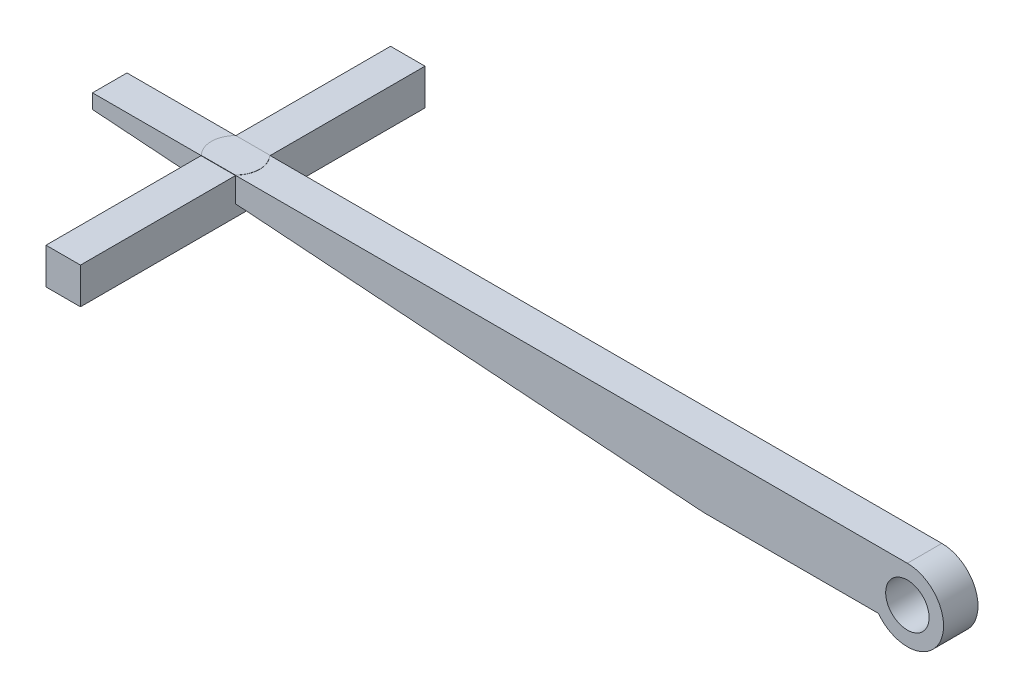
ISO-10303-21;
HEADER;
FILE_DESCRIPTION(('STEP AP214'),'2;1');
FILE_NAME('part.step','',(''),(''),'','','');
FILE_SCHEMA(('AUTOMOTIVE_DESIGN { 1 0 10303 214 1 1 1 1 }'));
ENDSEC;
DATA;
#1=APPLICATION_CONTEXT('core data for automotive mechanical design processes');
#2=APPLICATION_PROTOCOL_DEFINITION('international standard','automotive_design',2000,#1);
#3=PRODUCT_CONTEXT('',#1,'mechanical');
#4=PRODUCT('Part','Part','',(#3));
#5=PRODUCT_RELATED_PRODUCT_CATEGORY('part','',(#4));
#6=PRODUCT_DEFINITION_FORMATION('','',#4);
#7=PRODUCT_DEFINITION_CONTEXT('part definition',#1,'design');
#8=PRODUCT_DEFINITION('design','',#6,#7);
#9=PRODUCT_DEFINITION_SHAPE('','',#8);
#10=(LENGTH_UNIT() NAMED_UNIT(*) SI_UNIT(.MILLI.,.METRE.));
#11=(NAMED_UNIT(*) PLANE_ANGLE_UNIT() SI_UNIT($,.RADIAN.));
#12=(NAMED_UNIT(*) SI_UNIT($,.STERADIAN.) SOLID_ANGLE_UNIT());
#13=UNCERTAINTY_MEASURE_WITH_UNIT(LENGTH_MEASURE(1.E-05),#10,'distance_accuracy_value','');
#14=(GEOMETRIC_REPRESENTATION_CONTEXT(3) GLOBAL_UNCERTAINTY_ASSIGNED_CONTEXT((#13)) GLOBAL_UNIT_ASSIGNED_CONTEXT((#10,
#11,#12)) REPRESENTATION_CONTEXT('',''));
#15=CARTESIAN_POINT('',(0.,0.,0.));
#16=DIRECTION('',(0.,0.,1.));
#17=DIRECTION('',(1.,0.,0.));
#18=AXIS2_PLACEMENT_3D('',#15,#16,#17);
#19=CARTESIAN_POINT('',(-0.0500000000000828,10.5499999999999,5.));
#20=DIRECTION('',(0.,-1.,0.));
#21=DIRECTION('',(1.,0.,0.));
#22=AXIS2_PLACEMENT_3D('',#19,#20,#21);
#23=PLANE('',#22);
#24=CARTESIAN_POINT('',(-200.05,10.5500000000006,0.));
#25=DIRECTION('',(0.,1.,0.));
#26=DIRECTION('',(-1.,0.,0.));
#27=AXIS2_PLACEMENT_3D('',#24,#25,#26);
#28=CIRCLE('',#27,7.00000000000001);
#29=CARTESIAN_POINT('',(-195.151020514434,10.5500000000006,5.));
#30=VERTEX_POINT('',#29);
#31=CARTESIAN_POINT('',(-195.151020514434,10.5500000000006,-5.));
#32=VERTEX_POINT('',#31);
#33=EDGE_CURVE('E59',#30,#32,#28,.T.);
#34=ORIENTED_EDGE('',*,*,#33,.F.);
#35=DIRECTION('',(-1.,0.,0.));
#36=VECTOR('',#35,1.);
#37=CARTESIAN_POINT('',(-0.0500000000000828,10.5499999999999,5.));
#38=LINE('',#37,#36);
#39=CARTESIAN_POINT('',(-0.0500000000000827,10.5499999999999,5.));
#40=VERTEX_POINT('',#39);
#41=EDGE_CURVE('E200',#40,#30,#38,.T.);
#42=ORIENTED_EDGE('',*,*,#41,.F.);
#43=DIRECTION('',(0.,0.,-1.));
#44=VECTOR('',#43,1.);
#45=CARTESIAN_POINT('',(-0.0500000000000827,10.5499999999999,5.));
#46=LINE('',#45,#44);
#47=CARTESIAN_POINT('',(-0.0500000000000827,10.5499999999999,-5.));
#48=VERTEX_POINT('',#47);
#49=EDGE_CURVE('E349',#40,#48,#46,.T.);
#50=ORIENTED_EDGE('',*,*,#49,.T.);
#51=DIRECTION('',(-1.,0.,0.));
#52=VECTOR('',#51,1.);
#53=CARTESIAN_POINT('',(-0.0500000000000828,10.5499999999999,-5.));
#54=LINE('',#53,#52);
#55=EDGE_CURVE('E310',#48,#32,#54,.T.);
#56=ORIENTED_EDGE('',*,*,#55,.T.);
#57=EDGE_LOOP('',(#34,#42,#50,#56));
#58=FACE_BOUND('',#57,.T.);
#59=ADVANCED_FACE('F43',(#58),#23,.F.);
#60=CARTESIAN_POINT('',(-0.79213250000149,-10.3972819196618,5.));
#61=DIRECTION('',(-0.0708573888598422,-0.997486456270944,0.));
#62=DIRECTION('',(0.997486456270944,-0.0708573888598422,0.));
#63=AXIS2_PLACEMENT_3D('',#60,#61,#62);
#64=PLANE('',#63);
#65=DIRECTION('',(-0.997486456270944,0.0708573888598422,0.));
#66=VECTOR('',#65,1.);
#67=CARTESIAN_POINT('',(-0.79213250000149,-10.3972819196618,-5.));
#68=LINE('',#67,#66);
#69=CARTESIAN_POINT('',(-205.05,4.11236786469404,-5.));
#70=VERTEX_POINT('',#69);
#71=CARTESIAN_POINT('',(-236.55,6.3500000000007,-5.));
#72=VERTEX_POINT('',#71);
#73=EDGE_CURVE('E317',#70,#72,#68,.T.);
#74=ORIENTED_EDGE('',*,*,#73,.F.);
#75=DIRECTION('',(0.,0.,1.));
#76=VECTOR('',#75,1.);
#77=CARTESIAN_POINT('',(-205.05,4.11236786469404,5.));
#78=LINE('',#77,#76);
#79=CARTESIAN_POINT('',(-205.05,4.11236786469404,5.));
#80=VERTEX_POINT('',#79);
#81=EDGE_CURVE('E263',#70,#80,#78,.T.);
#82=ORIENTED_EDGE('',*,*,#81,.T.);
#83=DIRECTION('',(-0.997486456270944,0.0708573888598422,0.));
#84=VECTOR('',#83,1.);
#85=CARTESIAN_POINT('',(-0.79213250000149,-10.3972819196618,5.));
#86=LINE('',#85,#84);
#87=CARTESIAN_POINT('',(-236.55,6.3500000000007,5.));
#88=VERTEX_POINT('',#87);
#89=EDGE_CURVE('E287',#80,#88,#86,.T.);
#90=ORIENTED_EDGE('',*,*,#89,.T.);
#91=DIRECTION('',(0.,0.,-1.));
#92=VECTOR('',#91,1.);
#93=CARTESIAN_POINT('',(-236.55,6.3500000000007,5.));
#94=LINE('',#93,#92);
#95=EDGE_CURVE('E341',#88,#72,#94,.T.);
#96=ORIENTED_EDGE('',*,*,#95,.T.);
#97=EDGE_LOOP('',(#74,#82,#90,#96));
#98=FACE_BOUND('',#97,.T.);
#99=ADVANCED_FACE('F404',(#98),#64,.T.);
#100=CARTESIAN_POINT('',(-0.0500000000001194,0.0499999999998835,5.));
#101=DIRECTION('',(0.,0.,1.));
#102=DIRECTION('',(0.,-1.,0.));
#103=AXIS2_PLACEMENT_3D('',#100,#101,#102);
#104=PLANE('',#103);
#105=CARTESIAN_POINT('',(-0.0500000000001194,0.0499999999998835,5.));
#106=DIRECTION('',(0.,0.,1.));
#107=DIRECTION('',(0.,-1.,0.));
#108=AXIS2_PLACEMENT_3D('',#105,#106,#107);
#109=CIRCLE('',#108,6.3);
#110=CARTESIAN_POINT('',(-0.0500000000001414,-6.25000000000012,5.));
#111=VERTEX_POINT('',#110);
#112=EDGE_CURVE('E298',#111,#111,#109,.T.);
#113=ORIENTED_EDGE('',*,*,#112,.F.);
#114=EDGE_LOOP('',(#113));
#115=FACE_BOUND('',#114,.T.);
#116=ORIENTED_EDGE('',*,*,#89,.F.);
#117=DIRECTION('',(0.,1.,0.));
#118=VECTOR('',#117,1.);
#119=CARTESIAN_POINT('',(-205.05,0.0499999999998835,5.));
#120=LINE('',#119,#118);
#121=CARTESIAN_POINT('',(-205.05,10.5,5.));
#122=VERTEX_POINT('',#121);
#123=EDGE_CURVE('E267',#80,#122,#120,.T.);
#124=ORIENTED_EDGE('',*,*,#123,.T.);
#125=DIRECTION('',(-1.,0.,0.));
#126=VECTOR('',#125,1.);
#127=CARTESIAN_POINT('',(-0.0500000000001194,10.5,5.));
#128=LINE('',#127,#126);
#129=CARTESIAN_POINT('',(-195.05,10.5,5.));
#130=VERTEX_POINT('',#129);
#131=EDGE_CURVE('E254',#130,#122,#128,.T.);
#132=ORIENTED_EDGE('',*,*,#131,.F.);
#133=DIRECTION('',(0.,1.,0.));
#134=VECTOR('',#133,1.);
#135=CARTESIAN_POINT('',(-195.05,0.0499999999998835,5.));
#136=LINE('',#135,#134);
#137=CARTESIAN_POINT('',(-195.05,3.40200845666018,5.));
#138=VERTEX_POINT('',#137);
#139=EDGE_CURVE('E260',#138,#130,#136,.T.);
#140=ORIENTED_EDGE('',*,*,#139,.F.);
#141=CARTESIAN_POINT('',(-59.1750000000001,-6.24999999999991,5.));
#142=VERTEX_POINT('',#141);
#143=EDGE_CURVE('E288',#142,#138,#86,.T.);
#144=ORIENTED_EDGE('',*,*,#143,.F.);
#145=DIRECTION('',(1.,0.,0.));
#146=VECTOR('',#145,1.);
#147=CARTESIAN_POINT('',(-0.0500000000001413,-6.25000000000012,5.));
#148=LINE('',#147,#146);
#149=CARTESIAN_POINT('',(-8.45000000000014,-6.25000000000009,5.));
#150=VERTEX_POINT('',#149);
#151=EDGE_CURVE('E292',#142,#150,#148,.T.);
#152=ORIENTED_EDGE('',*,*,#151,.T.);
#153=CARTESIAN_POINT('',(-0.0500000000001194,0.0499999999998835,5.));
#154=DIRECTION('',(0.,0.,1.));
#155=DIRECTION('',(0.,-1.,0.));
#156=AXIS2_PLACEMENT_3D('',#153,#154,#155);
#157=CIRCLE('',#156,10.5);
#158=CARTESIAN_POINT('',(-1.53426500000282,-10.3445638393234,5.));
#159=VERTEX_POINT('',#158);
#160=EDGE_CURVE('E295',#150,#159,#157,.T.);
#161=ORIENTED_EDGE('',*,*,#160,.T.);
#162=DIRECTION('',(-0.997486456270944,0.0708573888598422,0.));
#163=VECTOR('',#162,1.);
#164=CARTESIAN_POINT('',(-0.79213250000149,-10.3972819196618,5.));
#165=LINE('',#164,#163);
#166=CARTESIAN_POINT('',(-0.0500000000001561,-10.4500000000001,5.));
#167=VERTEX_POINT('',#166);
#168=EDGE_CURVE('E272',#167,#159,#165,.T.);
#169=ORIENTED_EDGE('',*,*,#168,.F.);
#170=CARTESIAN_POINT('',(-0.0500000000001194,0.0499999999998835,5.));
#171=DIRECTION('',(0.,0.,1.));
#172=DIRECTION('',(0.,-1.,0.));
#173=AXIS2_PLACEMENT_3D('',#170,#171,#172);
#174=CIRCLE('',#173,10.5);
#175=EDGE_CURVE('E276',#167,#40,#174,.T.);
#176=ORIENTED_EDGE('',*,*,#175,.T.);
#177=ORIENTED_EDGE('',*,*,#41,.T.);
#178=DIRECTION('',(0.,-1.,0.));
#179=VECTOR('',#178,1.);
#180=CARTESIAN_POINT('',(-195.151020514434,10.6000000000006,5.));
#181=LINE('',#180,#179);
#182=CARTESIAN_POINT('',(-195.151020514434,10.6000000000006,5.));
#183=VERTEX_POINT('',#182);
#184=EDGE_CURVE('E180',#183,#30,#181,.T.);
#185=ORIENTED_EDGE('',*,*,#184,.F.);
#186=DIRECTION('',(1.,0.,0.));
#187=VECTOR('',#186,1.);
#188=CARTESIAN_POINT('',(0.,10.5999999999999,5.));
#189=LINE('',#188,#187);
#190=CARTESIAN_POINT('',(-204.948979485566,10.6000000000006,5.));
#191=VERTEX_POINT('',#190);
#192=EDGE_CURVE('E187',#191,#183,#189,.T.);
#193=ORIENTED_EDGE('',*,*,#192,.F.);
#194=DIRECTION('',(0.,-1.,0.));
#195=VECTOR('',#194,1.);
#196=CARTESIAN_POINT('',(-204.948979485566,10.6000000000006,5.));
#197=LINE('',#196,#195);
#198=CARTESIAN_POINT('',(-204.948979485566,10.5500000000006,5.));
#199=VERTEX_POINT('',#198);
#200=EDGE_CURVE('E415',#191,#199,#197,.T.);
#201=ORIENTED_EDGE('',*,*,#200,.T.);
#202=CARTESIAN_POINT('',(-236.55,10.5500000000007,5.));
#203=VERTEX_POINT('',#202);
#204=EDGE_CURVE('E280',#199,#203,#38,.T.);
#205=ORIENTED_EDGE('',*,*,#204,.T.);
#206=DIRECTION('',(0.,-1.,0.));
#207=VECTOR('',#206,1.);
#208=CARTESIAN_POINT('',(-236.55,0.0500000000007161,5.));
#209=LINE('',#208,#207);
#210=EDGE_CURVE('E283',#203,#88,#209,.T.);
#211=ORIENTED_EDGE('',*,*,#210,.T.);
#212=EDGE_LOOP('',(#116,#124,#132,#140,#144,#152,#161,#169,#176,#177,#185,#193,#201,#205,#211));
#213=FACE_BOUND('',#212,.T.);
#214=ADVANCED_FACE('F199',(#115,#213),#104,.T.);
#215=CARTESIAN_POINT('',(-0.0500000000001194,0.0499999999998835,-5.));
#216=DIRECTION('',(0.,0.,1.));
#217=DIRECTION('',(0.,-1.,0.));
#218=AXIS2_PLACEMENT_3D('',#215,#216,#217);
#219=PLANE('',#218);
#220=CARTESIAN_POINT('',(-0.0500000000001194,0.0499999999998835,-5.));
#221=DIRECTION('',(0.,0.,1.));
#222=DIRECTION('',(0.,-1.,0.));
#223=AXIS2_PLACEMENT_3D('',#220,#221,#222);
#224=CIRCLE('',#223,6.3);
#225=CARTESIAN_POINT('',(-0.0500000000001414,-6.25000000000012,-5.));
#226=VERTEX_POINT('',#225);
#227=EDGE_CURVE('E277',#226,#226,#224,.T.);
#228=ORIENTED_EDGE('',*,*,#227,.T.);
#229=EDGE_LOOP('',(#228));
#230=FACE_BOUND('',#229,.T.);
#231=DIRECTION('',(0.,1.,0.));
#232=VECTOR('',#231,1.);
#233=CARTESIAN_POINT('',(-205.05,0.0499999999998835,-5.));
#234=LINE('',#233,#232);
#235=CARTESIAN_POINT('',(-205.05,10.5,-5.));
#236=VERTEX_POINT('',#235);
#237=EDGE_CURVE('E11',#70,#236,#234,.T.);
#238=ORIENTED_EDGE('',*,*,#237,.F.);
#239=ORIENTED_EDGE('',*,*,#73,.T.);
#240=DIRECTION('',(0.,-1.,0.));
#241=VECTOR('',#240,1.);
#242=CARTESIAN_POINT('',(-236.55,0.0500000000007161,-5.));
#243=LINE('',#242,#241);
#244=CARTESIAN_POINT('',(-236.55,10.5500000000007,-5.));
#245=VERTEX_POINT('',#244);
#246=EDGE_CURVE('E313',#245,#72,#243,.T.);
#247=ORIENTED_EDGE('',*,*,#246,.F.);
#248=CARTESIAN_POINT('',(-204.948979485566,10.5500000000006,-5.));
#249=VERTEX_POINT('',#248);
#250=EDGE_CURVE('E309',#249,#245,#54,.T.);
#251=ORIENTED_EDGE('',*,*,#250,.F.);
#252=DIRECTION('',(0.,-1.,0.));
#253=VECTOR('',#252,1.);
#254=CARTESIAN_POINT('',(-204.948979485566,10.6000000000006,-5.));
#255=LINE('',#254,#253);
#256=CARTESIAN_POINT('',(-204.948979485566,10.6000000000006,-5.));
#257=VERTEX_POINT('',#256);
#258=EDGE_CURVE('E209',#257,#249,#255,.T.);
#259=ORIENTED_EDGE('',*,*,#258,.F.);
#260=DIRECTION('',(-1.,0.,0.));
#261=VECTOR('',#260,1.);
#262=CARTESIAN_POINT('',(0.,10.5999999999999,-5.));
#263=LINE('',#262,#261);
#264=CARTESIAN_POINT('',(-195.151020514434,10.6000000000006,-5.));
#265=VERTEX_POINT('',#264);
#266=EDGE_CURVE('E186',#265,#257,#263,.T.);
#267=ORIENTED_EDGE('',*,*,#266,.F.);
#268=DIRECTION('',(0.,-1.,0.));
#269=VECTOR('',#268,1.);
#270=CARTESIAN_POINT('',(-195.151020514434,10.6000000000006,-5.));
#271=LINE('',#270,#269);
#272=EDGE_CURVE('E182',#265,#32,#271,.T.);
#273=ORIENTED_EDGE('',*,*,#272,.T.);
#274=ORIENTED_EDGE('',*,*,#55,.F.);
#275=CARTESIAN_POINT('',(-0.0500000000001194,0.0499999999998835,-5.));
#276=DIRECTION('',(0.,0.,1.));
#277=DIRECTION('',(0.,-1.,0.));
#278=AXIS2_PLACEMENT_3D('',#275,#276,#277);
#279=CIRCLE('',#278,10.5);
#280=CARTESIAN_POINT('',(-0.0500000000001561,-10.4500000000001,-5.));
#281=VERTEX_POINT('',#280);
#282=EDGE_CURVE('E306',#281,#48,#279,.T.);
#283=ORIENTED_EDGE('',*,*,#282,.F.);
#284=DIRECTION('',(-0.997486456270944,0.0708573888598422,0.));
#285=VECTOR('',#284,1.);
#286=CARTESIAN_POINT('',(-0.79213250000149,-10.3972819196618,-5.));
#287=LINE('',#286,#285);
#288=CARTESIAN_POINT('',(-1.53426500000282,-10.3445638393234,-5.));
#289=VERTEX_POINT('',#288);
#290=EDGE_CURVE('E271',#281,#289,#287,.T.);
#291=ORIENTED_EDGE('',*,*,#290,.T.);
#292=CARTESIAN_POINT('',(-0.0500000000001194,0.0499999999998835,-5.));
#293=DIRECTION('',(0.,0.,1.));
#294=DIRECTION('',(0.,-1.,0.));
#295=AXIS2_PLACEMENT_3D('',#292,#293,#294);
#296=CIRCLE('',#295,10.5);
#297=CARTESIAN_POINT('',(-8.45000000000014,-6.25000000000009,-5.));
#298=VERTEX_POINT('',#297);
#299=EDGE_CURVE('E325',#298,#289,#296,.T.);
#300=ORIENTED_EDGE('',*,*,#299,.F.);
#301=DIRECTION('',(1.,0.,0.));
#302=VECTOR('',#301,1.);
#303=CARTESIAN_POINT('',(-0.0500000000001413,-6.25000000000012,-5.));
#304=LINE('',#303,#302);
#305=CARTESIAN_POINT('',(-59.1750000000001,-6.24999999999991,-5.));
#306=VERTEX_POINT('',#305);
#307=EDGE_CURVE('E322',#306,#298,#304,.T.);
#308=ORIENTED_EDGE('',*,*,#307,.F.);
#309=CARTESIAN_POINT('',(-195.05,3.40200845666018,-5.));
#310=VERTEX_POINT('',#309);
#311=EDGE_CURVE('E318',#306,#310,#68,.T.);
#312=ORIENTED_EDGE('',*,*,#311,.T.);
#313=DIRECTION('',(0.,1.,0.));
#314=VECTOR('',#313,1.);
#315=CARTESIAN_POINT('',(-195.05,0.0499999999998835,-5.));
#316=LINE('',#315,#314);
#317=CARTESIAN_POINT('',(-195.05,10.5,-5.));
#318=VERTEX_POINT('',#317);
#319=EDGE_CURVE('E52',#310,#318,#316,.T.);
#320=ORIENTED_EDGE('',*,*,#319,.T.);
#321=DIRECTION('',(-1.,0.,0.));
#322=VECTOR('',#321,1.);
#323=CARTESIAN_POINT('',(-0.0500000000001194,10.5,-5.));
#324=LINE('',#323,#322);
#325=EDGE_CURVE('E356',#318,#236,#324,.T.);
#326=ORIENTED_EDGE('',*,*,#325,.T.);
#327=EDGE_LOOP('',(#238,#239,#247,#251,#259,#267,#273,#274,#283,#291,#300,#308,#312,#320,#326));
#328=FACE_BOUND('',#327,.T.);
#329=ADVANCED_FACE('F363',(#230,#328),#219,.F.);
#330=CARTESIAN_POINT('',(-0.79213250000149,-10.3972819196618,5.));
#331=DIRECTION('',(-0.0708573888598422,-0.997486456270944,0.));
#332=DIRECTION('',(0.997486456270944,-0.0708573888598422,0.));
#333=AXIS2_PLACEMENT_3D('',#330,#331,#332);
#334=PLANE('',#333);
#335=ORIENTED_EDGE('',*,*,#290,.F.);
#336=DIRECTION('',(0.,0.,-1.));
#337=VECTOR('',#336,1.);
#338=CARTESIAN_POINT('',(-0.0500000000001561,-10.4500000000001,5.));
#339=LINE('',#338,#337);
#340=EDGE_CURVE('E353',#167,#281,#339,.T.);
#341=ORIENTED_EDGE('',*,*,#340,.F.);
#342=ORIENTED_EDGE('',*,*,#168,.T.);
#343=DIRECTION('',(0.,0.,-1.));
#344=VECTOR('',#343,1.);
#345=CARTESIAN_POINT('',(-1.53426500000282,-10.3445638393234,5.));
#346=LINE('',#345,#344);
#347=EDGE_CURVE('E302',#159,#289,#346,.T.);
#348=ORIENTED_EDGE('',*,*,#347,.T.);
#349=EDGE_LOOP('',(#335,#341,#342,#348));
#350=FACE_BOUND('',#349,.T.);
#351=ADVANCED_FACE('F45',(#350),#334,.T.);
#352=CARTESIAN_POINT('',(-0.0500000000001194,0.0499999999998835,5.));
#353=DIRECTION('',(0.,0.,-1.));
#354=DIRECTION('',(0.,1.,0.));
#355=AXIS2_PLACEMENT_3D('',#352,#353,#354);
#356=CYLINDRICAL_SURFACE('',#355,10.5);
#357=ORIENTED_EDGE('',*,*,#282,.T.);
#358=ORIENTED_EDGE('',*,*,#49,.F.);
#359=ORIENTED_EDGE('',*,*,#175,.F.);
#360=ORIENTED_EDGE('',*,*,#340,.T.);
#361=EDGE_LOOP('',(#357,#358,#359,#360));
#362=FACE_BOUND('',#361,.T.);
#363=ADVANCED_FACE('F435',(#362),#356,.T.);
#364=EDGE_CURVE('E67',#249,#199,#28,.T.);
#365=ORIENTED_EDGE('',*,*,#364,.F.);
#366=ORIENTED_EDGE('',*,*,#250,.T.);
#367=DIRECTION('',(0.,0.,-1.));
#368=VECTOR('',#367,1.);
#369=CARTESIAN_POINT('',(-236.55,10.5500000000007,5.));
#370=LINE('',#369,#368);
#371=EDGE_CURVE('E345',#203,#245,#370,.T.);
#372=ORIENTED_EDGE('',*,*,#371,.F.);
#373=ORIENTED_EDGE('',*,*,#204,.F.);
#374=EDGE_LOOP('',(#365,#366,#372,#373));
#375=FACE_BOUND('',#374,.T.);
#376=ADVANCED_FACE('F409',(#375),#23,.F.);
#377=CARTESIAN_POINT('',(-236.55,0.0500000000007161,5.));
#378=DIRECTION('',(1.,0.,0.));
#379=DIRECTION('',(0.,0.,1.));
#380=AXIS2_PLACEMENT_3D('',#377,#378,#379);
#381=PLANE('',#380);
#382=ORIENTED_EDGE('',*,*,#246,.T.);
#383=ORIENTED_EDGE('',*,*,#95,.F.);
#384=ORIENTED_EDGE('',*,*,#210,.F.);
#385=ORIENTED_EDGE('',*,*,#371,.T.);
#386=EDGE_LOOP('',(#382,#383,#384,#385));
#387=FACE_BOUND('',#386,.T.);
#388=ADVANCED_FACE('F414',(#387),#381,.F.);
#389=DIRECTION('',(0.,0.,1.));
#390=VECTOR('',#389,1.);
#391=CARTESIAN_POINT('',(-195.05,3.40200845666018,5.));
#392=LINE('',#391,#390);
#393=EDGE_CURVE('E257',#310,#138,#392,.T.);
#394=ORIENTED_EDGE('',*,*,#393,.F.);
#395=ORIENTED_EDGE('',*,*,#311,.F.);
#396=DIRECTION('',(0.,0.,-1.));
#397=VECTOR('',#396,1.);
#398=CARTESIAN_POINT('',(-59.1750000000001,-6.24999999999991,5.));
#399=LINE('',#398,#397);
#400=EDGE_CURVE('E338',#142,#306,#399,.T.);
#401=ORIENTED_EDGE('',*,*,#400,.F.);
#402=ORIENTED_EDGE('',*,*,#143,.T.);
#403=EDGE_LOOP('',(#394,#395,#401,#402));
#404=FACE_BOUND('',#403,.T.);
#405=ADVANCED_FACE('F372',(#404),#64,.T.);
#406=CARTESIAN_POINT('',(-0.0500000000001413,-6.25000000000012,5.));
#407=DIRECTION('',(0.,1.,0.));
#408=DIRECTION('',(-1.,0.,0.));
#409=AXIS2_PLACEMENT_3D('',#406,#407,#408);
#410=PLANE('',#409);
#411=ORIENTED_EDGE('',*,*,#307,.T.);
#412=DIRECTION('',(0.,0.,-1.));
#413=VECTOR('',#412,1.);
#414=CARTESIAN_POINT('',(-8.45000000000014,-6.25000000000009,5.));
#415=LINE('',#414,#413);
#416=EDGE_CURVE('E334',#150,#298,#415,.T.);
#417=ORIENTED_EDGE('',*,*,#416,.F.);
#418=ORIENTED_EDGE('',*,*,#151,.F.);
#419=ORIENTED_EDGE('',*,*,#400,.T.);
#420=EDGE_LOOP('',(#411,#417,#418,#419));
#421=FACE_BOUND('',#420,.T.);
#422=ADVANCED_FACE('F444',(#421),#410,.F.);
#423=CARTESIAN_POINT('',(-0.0500000000001194,0.0499999999998835,5.));
#424=DIRECTION('',(0.,0.,-1.));
#425=DIRECTION('',(0.,1.,0.));
#426=AXIS2_PLACEMENT_3D('',#423,#424,#425);
#427=CYLINDRICAL_SURFACE('',#426,10.5);
#428=ORIENTED_EDGE('',*,*,#299,.T.);
#429=ORIENTED_EDGE('',*,*,#347,.F.);
#430=ORIENTED_EDGE('',*,*,#160,.F.);
#431=ORIENTED_EDGE('',*,*,#416,.T.);
#432=EDGE_LOOP('',(#428,#429,#430,#431));
#433=FACE_BOUND('',#432,.T.);
#434=ADVANCED_FACE('F441',(#433),#427,.T.);
#435=CARTESIAN_POINT('',(-0.0500000000001194,0.0499999999998835,5.));
#436=DIRECTION('',(0.,0.,-1.));
#437=DIRECTION('',(0.,1.,0.));
#438=AXIS2_PLACEMENT_3D('',#435,#436,#437);
#439=CYLINDRICAL_SURFACE('',#438,6.3);
#440=ORIENTED_EDGE('',*,*,#112,.T.);
#441=EDGE_LOOP('',(#440));
#442=FACE_BOUND('',#441,.T.);
#443=ORIENTED_EDGE('',*,*,#227,.F.);
#444=EDGE_LOOP('',(#443));
#445=FACE_BOUND('',#444,.T.);
#446=ADVANCED_FACE('F451',(#442,#445),#439,.F.);
#447=CARTESIAN_POINT('',(0.,10.5,-5.));
#448=DIRECTION('',(0.,1.,0.));
#449=DIRECTION('',(0.,0.,1.));
#450=AXIS2_PLACEMENT_3D('',#447,#448,#449);
#451=PLANE('',#450);
#452=ORIENTED_EDGE('',*,*,#325,.F.);
#453=DIRECTION('',(0.,0.,1.));
#454=VECTOR('',#453,1.);
#455=CARTESIAN_POINT('',(-195.05,10.5,-5.));
#456=LINE('',#455,#454);
#457=CARTESIAN_POINT('',(-195.05,10.5,-50.));
#458=VERTEX_POINT('',#457);
#459=EDGE_CURVE('E227',#458,#318,#456,.T.);
#460=ORIENTED_EDGE('',*,*,#459,.F.);
#461=DIRECTION('',(-1.,0.,0.));
#462=VECTOR('',#461,1.);
#463=CARTESIAN_POINT('',(0.,10.5,-50.));
#464=LINE('',#463,#462);
#465=CARTESIAN_POINT('',(-205.05,10.5,-50.));
#466=VERTEX_POINT('',#465);
#467=EDGE_CURVE('E213',#458,#466,#464,.T.);
#468=ORIENTED_EDGE('',*,*,#467,.T.);
#469=DIRECTION('',(0.,0.,1.));
#470=VECTOR('',#469,1.);
#471=CARTESIAN_POINT('',(-205.05,10.5,-5.));
#472=LINE('',#471,#470);
#473=EDGE_CURVE('E219',#466,#236,#472,.T.);
#474=ORIENTED_EDGE('',*,*,#473,.T.);
#475=EDGE_LOOP('',(#452,#460,#468,#474));
#476=FACE_BOUND('',#475,.T.);
#477=ADVANCED_FACE('F400',(#476),#451,.T.);
#478=CARTESIAN_POINT('',(0.,10.5,-50.));
#479=DIRECTION('',(0.,0.,1.));
#480=DIRECTION('',(1.,0.,0.));
#481=AXIS2_PLACEMENT_3D('',#478,#479,#480);
#482=PLANE('',#481);
#483=DIRECTION('',(-1.,0.,0.));
#484=VECTOR('',#483,1.);
#485=CARTESIAN_POINT('',(0.,0.,-50.));
#486=LINE('',#485,#484);
#487=CARTESIAN_POINT('',(-195.05,0.,-50.));
#488=VERTEX_POINT('',#487);
#489=CARTESIAN_POINT('',(-205.05,0.,-50.));
#490=VERTEX_POINT('',#489);
#491=EDGE_CURVE('E202',#488,#490,#486,.T.);
#492=ORIENTED_EDGE('',*,*,#491,.T.);
#493=DIRECTION('',(0.,-1.,0.));
#494=VECTOR('',#493,1.);
#495=CARTESIAN_POINT('',(-205.05,10.5,-50.));
#496=LINE('',#495,#494);
#497=EDGE_CURVE('E250',#466,#490,#496,.T.);
#498=ORIENTED_EDGE('',*,*,#497,.F.);
#499=ORIENTED_EDGE('',*,*,#467,.F.);
#500=DIRECTION('',(0.,-1.,0.));
#501=VECTOR('',#500,1.);
#502=CARTESIAN_POINT('',(-195.05,10.5,-50.));
#503=LINE('',#502,#501);
#504=EDGE_CURVE('E230',#458,#488,#503,.T.);
#505=ORIENTED_EDGE('',*,*,#504,.T.);
#506=EDGE_LOOP('',(#492,#498,#499,#505));
#507=FACE_BOUND('',#506,.T.);
#508=ADVANCED_FACE('F398',(#507),#482,.F.);
#509=CARTESIAN_POINT('',(-205.05,10.5,-5.));
#510=DIRECTION('',(1.,0.,0.));
#511=DIRECTION('',(0.,0.,-1.));
#512=AXIS2_PLACEMENT_3D('',#509,#510,#511);
#513=PLANE('',#512);
#514=ORIENTED_EDGE('',*,*,#123,.F.);
#515=ORIENTED_EDGE('',*,*,#81,.F.);
#516=ORIENTED_EDGE('',*,*,#237,.T.);
#517=ORIENTED_EDGE('',*,*,#473,.F.);
#518=ORIENTED_EDGE('',*,*,#497,.T.);
#519=DIRECTION('',(0.,0.,1.));
#520=VECTOR('',#519,1.);
#521=CARTESIAN_POINT('',(-205.05,0.,-5.));
#522=LINE('',#521,#520);
#523=CARTESIAN_POINT('',(-205.05,0.,50.));
#524=VERTEX_POINT('',#523);
#525=EDGE_CURVE('E207',#490,#524,#522,.T.);
#526=ORIENTED_EDGE('',*,*,#525,.T.);
#527=DIRECTION('',(0.,-1.,0.));
#528=VECTOR('',#527,1.);
#529=CARTESIAN_POINT('',(-205.05,10.5,50.));
#530=LINE('',#529,#528);
#531=CARTESIAN_POINT('',(-205.05,10.5,50.));
#532=VERTEX_POINT('',#531);
#533=EDGE_CURVE('E247',#532,#524,#530,.T.);
#534=ORIENTED_EDGE('',*,*,#533,.F.);
#535=EDGE_CURVE('E217',#122,#532,#472,.T.);
#536=ORIENTED_EDGE('',*,*,#535,.F.);
#537=EDGE_LOOP('',(#514,#515,#516,#517,#518,#526,#534,#536));
#538=FACE_BOUND('',#537,.T.);
#539=ADVANCED_FACE('F387',(#538),#513,.F.);
#540=CARTESIAN_POINT('',(0.,10.5,50.));
#541=DIRECTION('',(0.,0.,1.));
#542=DIRECTION('',(1.,0.,0.));
#543=AXIS2_PLACEMENT_3D('',#540,#541,#542);
#544=PLANE('',#543);
#545=DIRECTION('',(-1.,0.,0.));
#546=VECTOR('',#545,1.);
#547=CARTESIAN_POINT('',(0.,0.,50.));
#548=LINE('',#547,#546);
#549=CARTESIAN_POINT('',(-195.05,0.,50.));
#550=VERTEX_POINT('',#549);
#551=EDGE_CURVE('E235',#550,#524,#548,.T.);
#552=ORIENTED_EDGE('',*,*,#551,.F.);
#553=DIRECTION('',(0.,-1.,0.));
#554=VECTOR('',#553,1.);
#555=CARTESIAN_POINT('',(-195.05,10.5,50.));
#556=LINE('',#555,#554);
#557=CARTESIAN_POINT('',(-195.05,10.5,50.));
#558=VERTEX_POINT('',#557);
#559=EDGE_CURVE('E244',#558,#550,#556,.T.);
#560=ORIENTED_EDGE('',*,*,#559,.F.);
#561=DIRECTION('',(-1.,0.,0.));
#562=VECTOR('',#561,1.);
#563=CARTESIAN_POINT('',(0.,10.5,50.));
#564=LINE('',#563,#562);
#565=EDGE_CURVE('E222',#558,#532,#564,.T.);
#566=ORIENTED_EDGE('',*,*,#565,.T.);
#567=ORIENTED_EDGE('',*,*,#533,.T.);
#568=EDGE_LOOP('',(#552,#560,#566,#567));
#569=FACE_BOUND('',#568,.T.);
#570=ADVANCED_FACE('F390',(#569),#544,.T.);
#571=CARTESIAN_POINT('',(-195.05,10.5,-5.));
#572=DIRECTION('',(1.,0.,0.));
#573=DIRECTION('',(0.,0.,-1.));
#574=AXIS2_PLACEMENT_3D('',#571,#572,#573);
#575=PLANE('',#574);
#576=ORIENTED_EDGE('',*,*,#393,.T.);
#577=ORIENTED_EDGE('',*,*,#139,.T.);
#578=EDGE_CURVE('E226',#130,#558,#456,.T.);
#579=ORIENTED_EDGE('',*,*,#578,.T.);
#580=ORIENTED_EDGE('',*,*,#559,.T.);
#581=DIRECTION('',(0.,0.,1.));
#582=VECTOR('',#581,1.);
#583=CARTESIAN_POINT('',(-195.05,0.,-5.));
#584=LINE('',#583,#582);
#585=EDGE_CURVE('E218',#488,#550,#584,.T.);
#586=ORIENTED_EDGE('',*,*,#585,.F.);
#587=ORIENTED_EDGE('',*,*,#504,.F.);
#588=ORIENTED_EDGE('',*,*,#459,.T.);
#589=ORIENTED_EDGE('',*,*,#319,.F.);
#590=EDGE_LOOP('',(#576,#577,#579,#580,#586,#587,#588,#589));
#591=FACE_BOUND('',#590,.T.);
#592=ADVANCED_FACE('F368',(#591),#575,.T.);
#593=ORIENTED_EDGE('',*,*,#578,.F.);
#594=ORIENTED_EDGE('',*,*,#131,.T.);
#595=ORIENTED_EDGE('',*,*,#535,.T.);
#596=ORIENTED_EDGE('',*,*,#565,.F.);
#597=EDGE_LOOP('',(#593,#594,#595,#596));
#598=FACE_BOUND('',#597,.T.);
#599=ADVANCED_FACE('F381',(#598),#451,.T.);
#600=CARTESIAN_POINT('',(0.,0.,-5.));
#601=DIRECTION('',(0.,1.,0.));
#602=DIRECTION('',(0.,0.,1.));
#603=AXIS2_PLACEMENT_3D('',#600,#601,#602);
#604=PLANE('',#603);
#605=ORIENTED_EDGE('',*,*,#491,.F.);
#606=ORIENTED_EDGE('',*,*,#585,.T.);
#607=ORIENTED_EDGE('',*,*,#551,.T.);
#608=ORIENTED_EDGE('',*,*,#525,.F.);
#609=EDGE_LOOP('',(#605,#606,#607,#608));
#610=FACE_BOUND('',#609,.T.);
#611=ADVANCED_FACE('F395',(#610),#604,.F.);
#612=CARTESIAN_POINT('',(-200.05,10.6000000000006,0.));
#613=DIRECTION('',(0.,-1.,0.));
#614=DIRECTION('',(1.,0.,0.));
#615=AXIS2_PLACEMENT_3D('',#612,#613,#614);
#616=CYLINDRICAL_SURFACE('',#615,7.00000000000001);
#617=ORIENTED_EDGE('',*,*,#33,.T.);
#618=ORIENTED_EDGE('',*,*,#272,.F.);
#619=CARTESIAN_POINT('',(-200.05,10.6000000000006,0.));
#620=DIRECTION('',(0.,1.,0.));
#621=DIRECTION('',(-1.,0.,0.));
#622=AXIS2_PLACEMENT_3D('',#619,#620,#621);
#623=CIRCLE('',#622,7.00000000000001);
#624=EDGE_CURVE('E176',#183,#265,#623,.T.);
#625=ORIENTED_EDGE('',*,*,#624,.F.);
#626=ORIENTED_EDGE('',*,*,#184,.T.);
#627=EDGE_LOOP('',(#617,#618,#625,#626));
#628=FACE_BOUND('',#627,.T.);
#629=ADVANCED_FACE('F178',(#628),#616,.T.);
#630=ORIENTED_EDGE('',*,*,#364,.T.);
#631=ORIENTED_EDGE('',*,*,#200,.F.);
#632=EDGE_CURVE('E189',#257,#191,#623,.T.);
#633=ORIENTED_EDGE('',*,*,#632,.F.);
#634=ORIENTED_EDGE('',*,*,#258,.T.);
#635=EDGE_LOOP('',(#630,#631,#633,#634));
#636=FACE_BOUND('',#635,.T.);
#637=ADVANCED_FACE('F419',(#636),#616,.T.);
#638=CARTESIAN_POINT('',(0.,10.5999999999999,-5.));
#639=DIRECTION('',(0.,1.,0.));
#640=DIRECTION('',(-1.,0.,0.));
#641=AXIS2_PLACEMENT_3D('',#638,#639,#640);
#642=PLANE('',#641);
#643=ORIENTED_EDGE('',*,*,#192,.T.);
#644=ORIENTED_EDGE('',*,*,#624,.T.);
#645=ORIENTED_EDGE('',*,*,#266,.T.);
#646=ORIENTED_EDGE('',*,*,#632,.T.);
#647=EDGE_LOOP('',(#643,#644,#645,#646));
#648=FACE_BOUND('',#647,.T.);
#649=ADVANCED_FACE('F191',(#648),#642,.T.);
#650=CLOSED_SHELL('',(#59,#99,#214,#329,#351,#363,#376,#388,#405,#422,#434,#446,#477,#508,#539,
#570,#592,#599,#611,#629,#637,#649));
#651=MANIFOLD_SOLID_BREP('B2',#650);
#652=ADVANCED_BREP_SHAPE_REPRESENTATION('',(#18,#651),#14);
#653=SHAPE_DEFINITION_REPRESENTATION(#9,#652);
ENDSEC;
END-ISO-10303-21;
